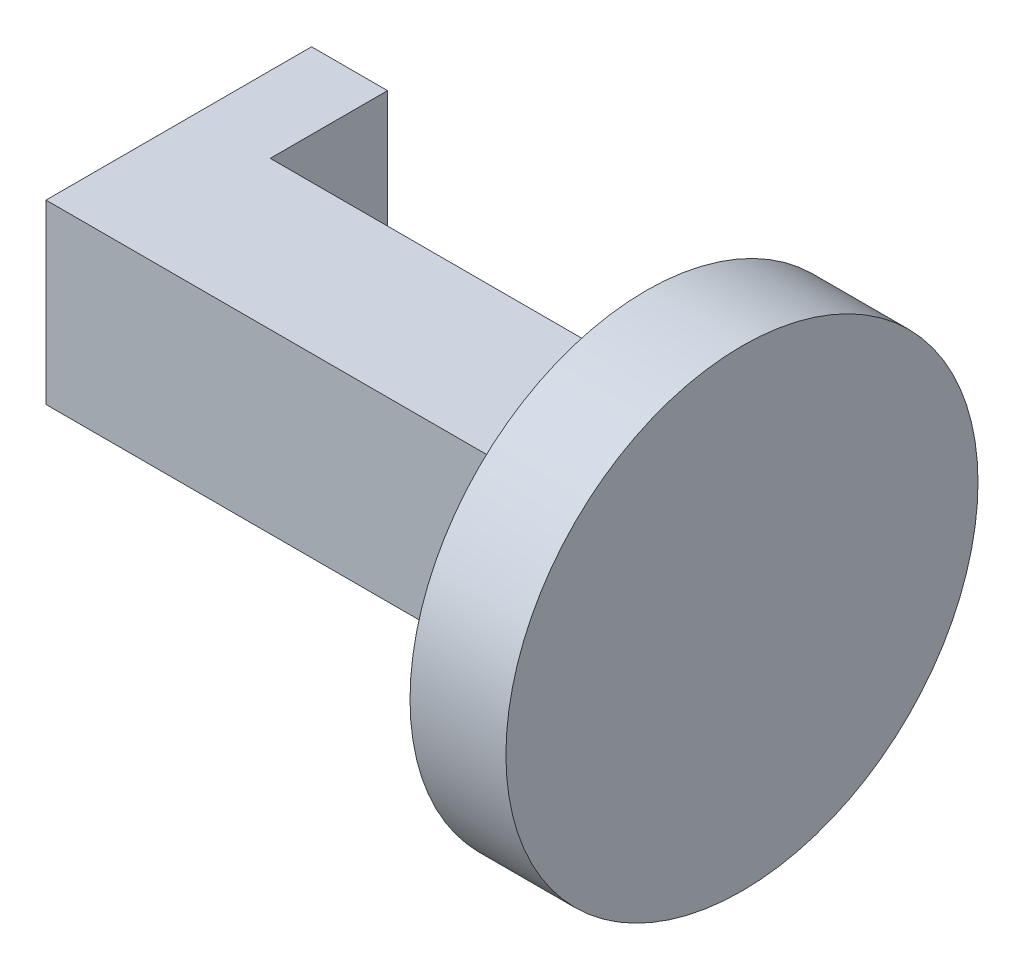
ISO-10303-21;
HEADER;
FILE_DESCRIPTION(('STEP AP214'),'2;1');
FILE_NAME('part.step','',(''),(''),'','','');
FILE_SCHEMA(('AUTOMOTIVE_DESIGN { 1 0 10303 214 1 1 1 1 }'));
ENDSEC;
DATA;
#1=APPLICATION_CONTEXT('core data for automotive mechanical design processes');
#2=APPLICATION_PROTOCOL_DEFINITION('international standard','automotive_design',2000,#1);
#3=PRODUCT_CONTEXT('',#1,'mechanical');
#4=PRODUCT('Part','Part','',(#3));
#5=PRODUCT_RELATED_PRODUCT_CATEGORY('part','',(#4));
#6=PRODUCT_DEFINITION_FORMATION('','',#4);
#7=PRODUCT_DEFINITION_CONTEXT('part definition',#1,'design');
#8=PRODUCT_DEFINITION('design','',#6,#7);
#9=PRODUCT_DEFINITION_SHAPE('','',#8);
#10=(LENGTH_UNIT() NAMED_UNIT(*) SI_UNIT(.MILLI.,.METRE.));
#11=(NAMED_UNIT(*) PLANE_ANGLE_UNIT() SI_UNIT($,.RADIAN.));
#12=(NAMED_UNIT(*) SI_UNIT($,.STERADIAN.) SOLID_ANGLE_UNIT());
#13=UNCERTAINTY_MEASURE_WITH_UNIT(LENGTH_MEASURE(1.E-05),#10,'distance_accuracy_value','');
#14=(GEOMETRIC_REPRESENTATION_CONTEXT(3) GLOBAL_UNCERTAINTY_ASSIGNED_CONTEXT((#13)) GLOBAL_UNIT_ASSIGNED_CONTEXT((#10,
#11,#12)) REPRESENTATION_CONTEXT('',''));
#15=CARTESIAN_POINT('',(0.,0.,0.));
#16=DIRECTION('',(0.,0.,1.));
#17=DIRECTION('',(1.,0.,0.));
#18=AXIS2_PLACEMENT_3D('',#15,#16,#17);
#19=CARTESIAN_POINT('',(26.875,6.,0.));
#20=DIRECTION('',(-1.,0.,0.));
#21=DIRECTION('',(0.,0.,1.));
#22=AXIS2_PLACEMENT_3D('',#19,#20,#21);
#23=CYLINDRICAL_SURFACE('',#22,0.6);
#24=CARTESIAN_POINT('',(15.275,6.,0.));
#25=DIRECTION('',(-1.,0.,0.));
#26=DIRECTION('',(0.,0.,1.));
#27=AXIS2_PLACEMENT_3D('',#24,#25,#26);
#28=CIRCLE('',#27,0.6);
#29=CARTESIAN_POINT('',(15.275,6.,0.599999999999994));
#30=VERTEX_POINT('',#29);
#31=EDGE_CURVE('E57',#30,#30,#28,.F.);
#32=ORIENTED_EDGE('',*,*,#31,.T.);
#33=EDGE_LOOP('',(#32));
#34=FACE_BOUND('',#33,.T.);
#35=CARTESIAN_POINT('',(20.375,6.,0.));
#36=DIRECTION('',(1.,0.,0.));
#37=DIRECTION('',(0.,0.,-1.));
#38=AXIS2_PLACEMENT_3D('',#35,#36,#37);
#39=CIRCLE('',#38,0.6);
#40=CARTESIAN_POINT('',(20.375,6.,-0.600000000000006));
#41=VERTEX_POINT('',#40);
#42=EDGE_CURVE('E11',#41,#41,#39,.T.);
#43=ORIENTED_EDGE('',*,*,#42,.F.);
#44=EDGE_LOOP('',(#43));
#45=FACE_BOUND('',#44,.T.);
#46=ADVANCED_FACE('F47',(#34,#45),#23,.T.);
#47=CARTESIAN_POINT('',(0.,12.,-5.025));
#48=DIRECTION('',(0.,0.,-1.));
#49=DIRECTION('',(-1.,0.,0.));
#50=AXIS2_PLACEMENT_3D('',#47,#48,#49);
#51=PLANE('',#50);
#52=DIRECTION('',(1.,0.,0.));
#53=VECTOR('',#52,1.);
#54=CARTESIAN_POINT('',(0.,0.,-5.025));
#55=LINE('',#54,#53);
#56=CARTESIAN_POINT('',(-10.125,0.,-5.025));
#57=VERTEX_POINT('',#56);
#58=CARTESIAN_POINT('',(15.275,0.,-5.025));
#59=VERTEX_POINT('',#58);
#60=EDGE_CURVE('E138',#57,#59,#55,.T.);
#61=ORIENTED_EDGE('',*,*,#60,.F.);
#62=DIRECTION('',(0.,-1.,0.));
#63=VECTOR('',#62,1.);
#64=CARTESIAN_POINT('',(-10.125,12.,-5.025));
#65=LINE('',#64,#63);
#66=CARTESIAN_POINT('',(-10.125,12.,-5.025));
#67=VERTEX_POINT('',#66);
#68=EDGE_CURVE('E99',#67,#57,#65,.T.);
#69=ORIENTED_EDGE('',*,*,#68,.F.);
#70=DIRECTION('',(1.,0.,0.));
#71=VECTOR('',#70,1.);
#72=CARTESIAN_POINT('',(0.,12.,-5.025));
#73=LINE('',#72,#71);
#74=CARTESIAN_POINT('',(15.275,12.,-5.025));
#75=VERTEX_POINT('',#74);
#76=EDGE_CURVE('E158',#67,#75,#73,.T.);
#77=ORIENTED_EDGE('',*,*,#76,.T.);
#78=DIRECTION('',(0.,-1.,0.));
#79=VECTOR('',#78,1.);
#80=CARTESIAN_POINT('',(15.275,12.,-5.025));
#81=LINE('',#80,#79);
#82=EDGE_CURVE('E94',#75,#59,#81,.T.);
#83=ORIENTED_EDGE('',*,*,#82,.T.);
#84=EDGE_LOOP('',(#61,#69,#77,#83));
#85=FACE_BOUND('',#84,.T.);
#86=ADVANCED_FACE('F49',(#85),#51,.T.);
#87=CARTESIAN_POINT('',(-10.125,12.,0.));
#88=DIRECTION('',(1.,0.,0.));
#89=DIRECTION('',(0.,0.,-1.));
#90=AXIS2_PLACEMENT_3D('',#87,#88,#89);
#91=PLANE('',#90);
#92=DIRECTION('',(0.,0.,1.));
#93=VECTOR('',#92,1.);
#94=CARTESIAN_POINT('',(-10.125,0.,0.));
#95=LINE('',#94,#93);
#96=CARTESIAN_POINT('',(-10.125,0.,-12.975));
#97=VERTEX_POINT('',#96);
#98=EDGE_CURVE('E142',#97,#57,#95,.T.);
#99=ORIENTED_EDGE('',*,*,#98,.F.);
#100=DIRECTION('',(0.,-1.,0.));
#101=VECTOR('',#100,1.);
#102=CARTESIAN_POINT('',(-10.125,12.,-12.975));
#103=LINE('',#102,#101);
#104=CARTESIAN_POINT('',(-10.125,12.,-12.975));
#105=VERTEX_POINT('',#104);
#106=EDGE_CURVE('E165',#105,#97,#103,.T.);
#107=ORIENTED_EDGE('',*,*,#106,.F.);
#108=DIRECTION('',(0.,0.,1.));
#109=VECTOR('',#108,1.);
#110=CARTESIAN_POINT('',(-10.125,12.,0.));
#111=LINE('',#110,#109);
#112=EDGE_CURVE('E132',#105,#67,#111,.T.);
#113=ORIENTED_EDGE('',*,*,#112,.T.);
#114=ORIENTED_EDGE('',*,*,#68,.T.);
#115=EDGE_LOOP('',(#99,#107,#113,#114));
#116=FACE_BOUND('',#115,.T.);
#117=ADVANCED_FACE('F184',(#116),#91,.T.);
#118=CARTESIAN_POINT('',(0.,12.,-12.975));
#119=DIRECTION('',(0.,0.,-1.));
#120=DIRECTION('',(-1.,0.,0.));
#121=AXIS2_PLACEMENT_3D('',#118,#119,#120);
#122=PLANE('',#121);
#123=DIRECTION('',(1.,0.,0.));
#124=VECTOR('',#123,1.);
#125=CARTESIAN_POINT('',(0.,0.,-12.975));
#126=LINE('',#125,#124);
#127=CARTESIAN_POINT('',(-15.275,0.,-12.975));
#128=VERTEX_POINT('',#127);
#129=EDGE_CURVE('E147',#128,#97,#126,.T.);
#130=ORIENTED_EDGE('',*,*,#129,.F.);
#131=DIRECTION('',(0.,-1.,0.));
#132=VECTOR('',#131,1.);
#133=CARTESIAN_POINT('',(-15.275,12.,-12.975));
#134=LINE('',#133,#132);
#135=CARTESIAN_POINT('',(-15.275,12.,-12.975));
#136=VERTEX_POINT('',#135);
#137=EDGE_CURVE('E117',#136,#128,#134,.T.);
#138=ORIENTED_EDGE('',*,*,#137,.F.);
#139=DIRECTION('',(1.,0.,0.));
#140=VECTOR('',#139,1.);
#141=CARTESIAN_POINT('',(0.,12.,-12.975));
#142=LINE('',#141,#140);
#143=EDGE_CURVE('E128',#136,#105,#142,.T.);
#144=ORIENTED_EDGE('',*,*,#143,.T.);
#145=ORIENTED_EDGE('',*,*,#106,.T.);
#146=EDGE_LOOP('',(#130,#138,#144,#145));
#147=FACE_BOUND('',#146,.T.);
#148=ADVANCED_FACE('F188',(#147),#122,.T.);
#149=CARTESIAN_POINT('',(-15.275,12.,0.));
#150=DIRECTION('',(-1.,0.,0.));
#151=DIRECTION('',(0.,0.,1.));
#152=AXIS2_PLACEMENT_3D('',#149,#150,#151);
#153=PLANE('',#152);
#154=DIRECTION('',(0.,0.,-1.));
#155=VECTOR('',#154,1.);
#156=CARTESIAN_POINT('',(-15.275,0.,0.));
#157=LINE('',#156,#155);
#158=CARTESIAN_POINT('',(-15.275,0.,5.025));
#159=VERTEX_POINT('',#158);
#160=EDGE_CURVE('E115',#159,#128,#157,.T.);
#161=ORIENTED_EDGE('',*,*,#160,.F.);
#162=DIRECTION('',(0.,-1.,0.));
#163=VECTOR('',#162,1.);
#164=CARTESIAN_POINT('',(-15.275,12.,5.025));
#165=LINE('',#164,#163);
#166=CARTESIAN_POINT('',(-15.275,12.,5.025));
#167=VERTEX_POINT('',#166);
#168=EDGE_CURVE('E109',#167,#159,#165,.T.);
#169=ORIENTED_EDGE('',*,*,#168,.F.);
#170=DIRECTION('',(0.,0.,-1.));
#171=VECTOR('',#170,1.);
#172=CARTESIAN_POINT('',(-15.275,12.,0.));
#173=LINE('',#172,#171);
#174=EDGE_CURVE('E113',#167,#136,#173,.T.);
#175=ORIENTED_EDGE('',*,*,#174,.T.);
#176=ORIENTED_EDGE('',*,*,#137,.T.);
#177=EDGE_LOOP('',(#161,#169,#175,#176));
#178=FACE_BOUND('',#177,.T.);
#179=ADVANCED_FACE('F111',(#178),#153,.T.);
#180=CARTESIAN_POINT('',(0.,12.,5.025));
#181=DIRECTION('',(0.,0.,-1.));
#182=DIRECTION('',(-1.,0.,0.));
#183=AXIS2_PLACEMENT_3D('',#180,#181,#182);
#184=PLANE('',#183);
#185=DIRECTION('',(1.,0.,0.));
#186=VECTOR('',#185,1.);
#187=CARTESIAN_POINT('',(0.,0.,5.025));
#188=LINE('',#187,#186);
#189=CARTESIAN_POINT('',(15.275,0.,5.025));
#190=VERTEX_POINT('',#189);
#191=EDGE_CURVE('E87',#159,#190,#188,.T.);
#192=ORIENTED_EDGE('',*,*,#191,.T.);
#193=DIRECTION('',(0.,-1.,0.));
#194=VECTOR('',#193,1.);
#195=CARTESIAN_POINT('',(15.275,12.,5.025));
#196=LINE('',#195,#194);
#197=CARTESIAN_POINT('',(15.275,12.,5.025));
#198=VERTEX_POINT('',#197);
#199=EDGE_CURVE('E118',#198,#190,#196,.T.);
#200=ORIENTED_EDGE('',*,*,#199,.F.);
#201=DIRECTION('',(1.,0.,0.));
#202=VECTOR('',#201,1.);
#203=CARTESIAN_POINT('',(0.,12.,5.025));
#204=LINE('',#203,#202);
#205=EDGE_CURVE('E120',#167,#198,#204,.T.);
#206=ORIENTED_EDGE('',*,*,#205,.F.);
#207=ORIENTED_EDGE('',*,*,#168,.T.);
#208=EDGE_LOOP('',(#192,#200,#206,#207));
#209=FACE_BOUND('',#208,.T.);
#210=ADVANCED_FACE('F121',(#209),#184,.F.);
#211=CARTESIAN_POINT('',(15.275,12.,0.));
#212=DIRECTION('',(-1.,0.,0.));
#213=DIRECTION('',(0.,0.,1.));
#214=AXIS2_PLACEMENT_3D('',#211,#212,#213);
#215=PLANE('',#214);
#216=ORIENTED_EDGE('',*,*,#31,.F.);
#217=EDGE_LOOP('',(#216));
#218=FACE_BOUND('',#217,.T.);
#219=DIRECTION('',(0.,0.,-1.));
#220=VECTOR('',#219,1.);
#221=CARTESIAN_POINT('',(15.275,0.,0.));
#222=LINE('',#221,#220);
#223=EDGE_CURVE('E155',#190,#59,#222,.T.);
#224=ORIENTED_EDGE('',*,*,#223,.T.);
#225=ORIENTED_EDGE('',*,*,#82,.F.);
#226=DIRECTION('',(0.,0.,-1.));
#227=VECTOR('',#226,1.);
#228=CARTESIAN_POINT('',(15.275,12.,0.));
#229=LINE('',#228,#227);
#230=EDGE_CURVE('E65',#198,#75,#229,.T.);
#231=ORIENTED_EDGE('',*,*,#230,.F.);
#232=ORIENTED_EDGE('',*,*,#199,.T.);
#233=EDGE_LOOP('',(#224,#225,#231,#232));
#234=FACE_BOUND('',#233,.T.);
#235=ADVANCED_FACE('F175',(#218,#234),#215,.F.);
#236=CARTESIAN_POINT('',(0.,12.,0.));
#237=DIRECTION('',(0.,1.,0.));
#238=DIRECTION('',(0.,0.,1.));
#239=AXIS2_PLACEMENT_3D('',#236,#237,#238);
#240=PLANE('',#239);
#241=ORIENTED_EDGE('',*,*,#76,.F.);
#242=ORIENTED_EDGE('',*,*,#112,.F.);
#243=ORIENTED_EDGE('',*,*,#143,.F.);
#244=ORIENTED_EDGE('',*,*,#174,.F.);
#245=ORIENTED_EDGE('',*,*,#205,.T.);
#246=ORIENTED_EDGE('',*,*,#230,.T.);
#247=EDGE_LOOP('',(#241,#242,#243,#244,#245,#246));
#248=FACE_BOUND('',#247,.T.);
#249=ADVANCED_FACE('F125',(#248),#240,.T.);
#250=CARTESIAN_POINT('',(0.,0.,0.));
#251=DIRECTION('',(0.,1.,0.));
#252=DIRECTION('',(0.,0.,1.));
#253=AXIS2_PLACEMENT_3D('',#250,#251,#252);
#254=PLANE('',#253);
#255=ORIENTED_EDGE('',*,*,#60,.T.);
#256=ORIENTED_EDGE('',*,*,#223,.F.);
#257=ORIENTED_EDGE('',*,*,#191,.F.);
#258=ORIENTED_EDGE('',*,*,#160,.T.);
#259=ORIENTED_EDGE('',*,*,#129,.T.);
#260=ORIENTED_EDGE('',*,*,#98,.T.);
#261=EDGE_LOOP('',(#255,#256,#257,#258,#259,#260));
#262=FACE_BOUND('',#261,.T.);
#263=ADVANCED_FACE('F181',(#262),#254,.F.);
#264=CARTESIAN_POINT('',(20.375,6.,0.));
#265=DIRECTION('',(1.,0.,0.));
#266=DIRECTION('',(0.,0.,-1.));
#267=AXIS2_PLACEMENT_3D('',#264,#265,#266);
#268=CYLINDRICAL_SURFACE('',#267,16.);
#269=CARTESIAN_POINT('',(20.375,6.,0.));
#270=DIRECTION('',(1.,0.,0.));
#271=DIRECTION('',(0.,0.,-1.));
#272=AXIS2_PLACEMENT_3D('',#269,#270,#271);
#273=CIRCLE('',#272,16.);
#274=CARTESIAN_POINT('',(20.375,6.,-16.));
#275=VERTEX_POINT('',#274);
#276=EDGE_CURVE('E143',#275,#275,#273,.T.);
#277=CARTESIAN_POINT('',(26.875,6.,0.));
#278=DIRECTION('',(1.,0.,0.));
#279=DIRECTION('',(0.,0.,-1.));
#280=AXIS2_PLACEMENT_3D('',#277,#278,#279);
#281=CIRCLE('',#280,16.);
#282=CARTESIAN_POINT('',(26.875,6.,-16.));
#283=VERTEX_POINT('',#282);
#284=EDGE_CURVE('E218',#283,#283,#281,.T.);
#285=CARTESIAN_POINT('',(20.375,6.,-16.));
#286=CARTESIAN_POINT('',(20.4427083333333,6.,-16.));
#287=CARTESIAN_POINT('',(20.5104166666667,6.,-16.));
#288=CARTESIAN_POINT('',(20.6458333333333,6.,-16.));
#289=CARTESIAN_POINT('',(20.7135416666667,6.,-16.));
#290=CARTESIAN_POINT('',(20.8489583333333,6.,-16.));
#291=CARTESIAN_POINT('',(20.9166666666667,6.,-16.));
#292=CARTESIAN_POINT('',(21.0520833333333,6.,-16.));
#293=CARTESIAN_POINT('',(21.1197916666667,6.,-16.));
#294=CARTESIAN_POINT('',(21.2552083333333,6.,-16.));
#295=CARTESIAN_POINT('',(21.3229166666667,6.,-16.));
#296=CARTESIAN_POINT('',(21.4583333333333,6.,-16.));
#297=CARTESIAN_POINT('',(21.5260416666667,6.,-16.));
#298=CARTESIAN_POINT('',(21.6614583333333,6.,-16.));
#299=CARTESIAN_POINT('',(21.7291666666667,6.,-16.));
#300=CARTESIAN_POINT('',(21.8645833333333,6.,-16.));
#301=CARTESIAN_POINT('',(21.9322916666667,6.,-16.));
#302=CARTESIAN_POINT('',(22.0677083333333,6.,-16.));
#303=CARTESIAN_POINT('',(22.1354166666667,6.,-16.));
#304=CARTESIAN_POINT('',(22.2708333333333,6.,-16.));
#305=CARTESIAN_POINT('',(22.3385416666667,6.,-16.));
#306=CARTESIAN_POINT('',(22.4739583333333,6.,-16.));
#307=CARTESIAN_POINT('',(22.5416666666667,6.,-16.));
#308=CARTESIAN_POINT('',(22.6770833333333,6.,-16.));
#309=CARTESIAN_POINT('',(22.7447916666667,6.,-16.));
#310=CARTESIAN_POINT('',(22.8802083333333,6.,-16.));
#311=CARTESIAN_POINT('',(22.9479166666667,6.,-16.));
#312=CARTESIAN_POINT('',(23.0833333333333,6.,-16.));
#313=CARTESIAN_POINT('',(23.1510416666667,6.,-16.));
#314=CARTESIAN_POINT('',(23.2864583333333,6.,-16.));
#315=CARTESIAN_POINT('',(23.3541666666667,6.,-16.));
#316=CARTESIAN_POINT('',(23.4895833333333,6.,-16.));
#317=CARTESIAN_POINT('',(23.5572916666667,6.,-16.));
#318=CARTESIAN_POINT('',(23.6927083333333,6.,-16.));
#319=CARTESIAN_POINT('',(23.7604166666667,6.,-16.));
#320=CARTESIAN_POINT('',(23.8958333333333,6.,-16.));
#321=CARTESIAN_POINT('',(23.9635416666667,6.,-16.));
#322=CARTESIAN_POINT('',(24.0989583333333,6.,-16.));
#323=CARTESIAN_POINT('',(24.1666666666667,6.,-16.));
#324=CARTESIAN_POINT('',(24.3020833333333,6.,-16.));
#325=CARTESIAN_POINT('',(24.3697916666667,6.,-16.));
#326=CARTESIAN_POINT('',(24.5052083333333,6.,-16.));
#327=CARTESIAN_POINT('',(24.5729166666667,6.,-16.));
#328=CARTESIAN_POINT('',(24.7083333333333,6.,-16.));
#329=CARTESIAN_POINT('',(24.7760416666667,6.,-16.));
#330=CARTESIAN_POINT('',(24.9114583333333,6.,-16.));
#331=CARTESIAN_POINT('',(24.9791666666667,6.,-16.));
#332=CARTESIAN_POINT('',(25.1145833333333,6.,-16.));
#333=CARTESIAN_POINT('',(25.1822916666667,6.,-16.));
#334=CARTESIAN_POINT('',(25.3177083333333,6.,-16.));
#335=CARTESIAN_POINT('',(25.3854166666667,6.,-16.));
#336=CARTESIAN_POINT('',(25.5208333333333,6.,-16.));
#337=CARTESIAN_POINT('',(25.5885416666667,6.,-16.));
#338=CARTESIAN_POINT('',(25.7239583333333,6.,-16.));
#339=CARTESIAN_POINT('',(25.7916666666667,6.,-16.));
#340=CARTESIAN_POINT('',(25.9270833333333,6.,-16.));
#341=CARTESIAN_POINT('',(25.9947916666667,6.,-16.));
#342=CARTESIAN_POINT('',(26.1302083333333,6.,-16.));
#343=CARTESIAN_POINT('',(26.1979166666667,6.,-16.));
#344=CARTESIAN_POINT('',(26.3333333333333,6.,-16.));
#345=CARTESIAN_POINT('',(26.4010416666667,6.,-16.));
#346=CARTESIAN_POINT('',(26.5364583333333,6.,-16.));
#347=CARTESIAN_POINT('',(26.6041666666667,6.,-16.));
#348=CARTESIAN_POINT('',(26.7395833333333,6.,-16.));
#349=CARTESIAN_POINT('',(26.8072916666667,6.,-16.));
#350=CARTESIAN_POINT('',(26.875,6.,-16.));
#351=B_SPLINE_CURVE_WITH_KNOTS('',3,(#285,#286,#287,#288,#289,#290,#291,#292,#293,#294,#295,
#296,#297,#298,#299,#300,#301,#302,#303,#304,#305,#306,#307,#308,#309,#310,#311,#312,#313,#314,
#315,#316,#317,#318,#319,#320,#321,#322,#323,#324,#325,#326,#327,#328,#329,#330,#331,#332,#333,
#334,#335,#336,#337,#338,#339,#340,#341,#342,#343,#344,#345,#346,#347,#348,#349,#350),
.UNSPECIFIED.,.F.,.F.,(4,2,2,2,2,2,2,2,2,2,2,2,2,2,2,2,2,2,2,2,2,2,2,2,2,2,2,2,2,2,2,2,4),(0.,
0.203124999999998,0.406249999999997,0.609374999999999,0.812499999999997,1.015625,1.21875,
1.421875,1.625,1.828125,2.03125,2.234375,2.4375,2.640625,2.84375,3.046875,3.25,3.453125,3.65625,
3.859375,4.0625,4.265625,4.46875,4.671875,4.875,5.078125,5.28125,5.484375,5.6875,5.890625,
6.09375,6.296875,6.5),.UNSPECIFIED.);
#352=EDGE_CURVE('BSEAM202',#275,#283,#351,.T.);
#353=ORIENTED_EDGE('',*,*,#276,.T.);
#354=ORIENTED_EDGE('',*,*,#284,.F.);
#355=ORIENTED_EDGE('',*,*,#352,.T.);
#356=ORIENTED_EDGE('',*,*,#352,.F.);
#357=EDGE_LOOP('',(#353,#355,#354,#356));
#358=FACE_BOUND('',#357,.T.);
#359=ADVANCED_FACE('F202',(#358),#268,.T.);
#360=CARTESIAN_POINT('',(20.375,6.,0.));
#361=DIRECTION('',(1.,0.,0.));
#362=DIRECTION('',(0.,0.,-1.));
#363=AXIS2_PLACEMENT_3D('',#360,#361,#362);
#364=PLANE('',#363);
#365=ORIENTED_EDGE('',*,*,#42,.T.);
#366=EDGE_LOOP('',(#365));
#367=FACE_BOUND('',#366,.T.);
#368=ORIENTED_EDGE('',*,*,#276,.F.);
#369=EDGE_LOOP('',(#368));
#370=FACE_BOUND('',#369,.T.);
#371=ADVANCED_FACE('F228',(#367,#370),#364,.F.);
#372=CARTESIAN_POINT('',(26.875,6.,0.));
#373=DIRECTION('',(1.,0.,0.));
#374=DIRECTION('',(0.,0.,-1.));
#375=AXIS2_PLACEMENT_3D('',#372,#373,#374);
#376=PLANE('',#375);
#377=ORIENTED_EDGE('',*,*,#284,.T.);
#378=EDGE_LOOP('',(#377));
#379=FACE_BOUND('',#378,.T.);
#380=ADVANCED_FACE('F197',(#379),#376,.T.);
#381=CLOSED_SHELL('',(#46,#86,#117,#148,#179,#210,#235,#249,#263,#359,#371,#380));
#382=MANIFOLD_SOLID_BREP('B2',#381);
#383=ADVANCED_BREP_SHAPE_REPRESENTATION('',(#18,#382),#14);
#384=SHAPE_DEFINITION_REPRESENTATION(#9,#383);
ENDSEC;
END-ISO-10303-21;
